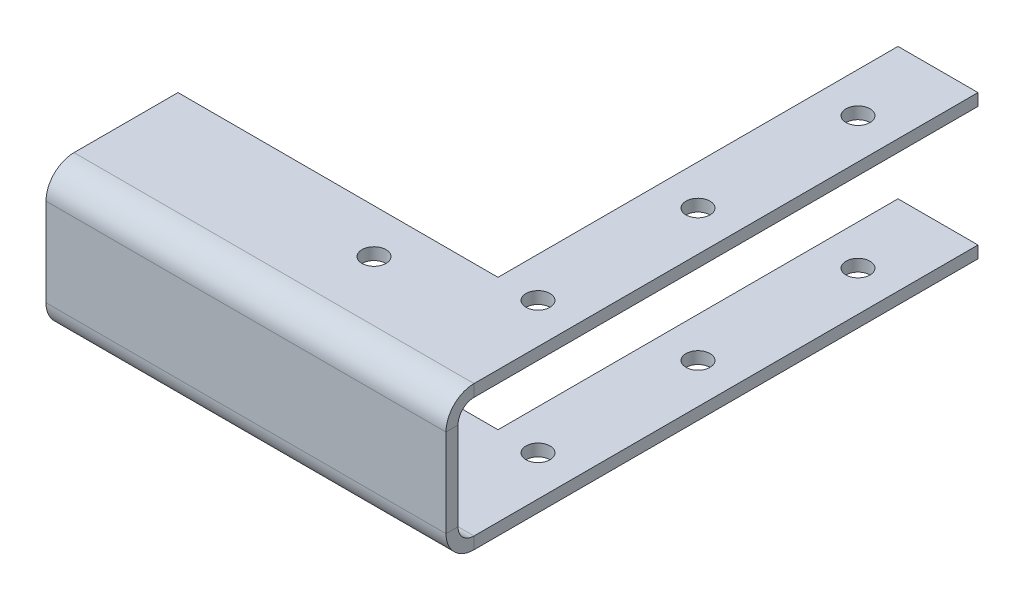
ISO-10303-21;
HEADER;
FILE_DESCRIPTION(('STEP AP214'),'2;1');
FILE_NAME('part.step','',(''),(''),'','','');
FILE_SCHEMA(('AUTOMOTIVE_DESIGN { 1 0 10303 214 1 1 1 1 }'));
ENDSEC;
DATA;
#1=APPLICATION_CONTEXT('core data for automotive mechanical design processes');
#2=APPLICATION_PROTOCOL_DEFINITION('international standard','automotive_design',2000,#1);
#3=PRODUCT_CONTEXT('',#1,'mechanical');
#4=PRODUCT('Part','Part','',(#3));
#5=PRODUCT_RELATED_PRODUCT_CATEGORY('part','',(#4));
#6=PRODUCT_DEFINITION_FORMATION('','',#4);
#7=PRODUCT_DEFINITION_CONTEXT('part definition',#1,'design');
#8=PRODUCT_DEFINITION('design','',#6,#7);
#9=PRODUCT_DEFINITION_SHAPE('','',#8);
#10=(LENGTH_UNIT() NAMED_UNIT(*) SI_UNIT(.MILLI.,.METRE.));
#11=(NAMED_UNIT(*) PLANE_ANGLE_UNIT() SI_UNIT($,.RADIAN.));
#12=(NAMED_UNIT(*) SI_UNIT($,.STERADIAN.) SOLID_ANGLE_UNIT());
#13=UNCERTAINTY_MEASURE_WITH_UNIT(LENGTH_MEASURE(1.E-05),#10,'distance_accuracy_value','');
#14=(GEOMETRIC_REPRESENTATION_CONTEXT(3) GLOBAL_UNCERTAINTY_ASSIGNED_CONTEXT((#13)) GLOBAL_UNIT_ASSIGNED_CONTEXT((#10,
#11,#12)) REPRESENTATION_CONTEXT('',''));
#15=CARTESIAN_POINT('',(0.,0.,0.));
#16=DIRECTION('',(0.,0.,1.));
#17=DIRECTION('',(1.,0.,0.));
#18=AXIS2_PLACEMENT_3D('',#15,#16,#17);
#19=CARTESIAN_POINT('',(-25.,9.00000000000004,-15.));
#20=DIRECTION('',(0.,0.,1.));
#21=DIRECTION('',(0.,-1.,0.));
#22=AXIS2_PLACEMENT_3D('',#19,#20,#21);
#23=PLANE('',#22);
#24=DIRECTION('',(0.,1.,0.));
#25=VECTOR('',#24,1.);
#26=CARTESIAN_POINT('',(15.,7.50000000000005,-15.));
#27=LINE('',#26,#25);
#28=CARTESIAN_POINT('',(15.,7.50000000000005,-15.));
#29=VERTEX_POINT('',#28);
#30=CARTESIAN_POINT('',(15.,9.00000000000005,-15.));
#31=VERTEX_POINT('',#30);
#32=EDGE_CURVE('E48',#29,#31,#27,.T.);
#33=ORIENTED_EDGE('',*,*,#32,.F.);
#34=DIRECTION('',(-1.,0.,0.));
#35=VECTOR('',#34,1.);
#36=CARTESIAN_POINT('',(-25.,7.50000000000004,-15.));
#37=LINE('',#36,#35);
#38=CARTESIAN_POINT('',(-25.,7.50000000000004,-15.));
#39=VERTEX_POINT('',#38);
#40=EDGE_CURVE('E158',#29,#39,#37,.T.);
#41=ORIENTED_EDGE('',*,*,#40,.T.);
#42=DIRECTION('',(0.,-1.,0.));
#43=VECTOR('',#42,1.);
#44=CARTESIAN_POINT('',(-25.,9.00000000000004,-15.));
#45=LINE('',#44,#43);
#46=CARTESIAN_POINT('',(-25.,9.00000000000004,-15.));
#47=VERTEX_POINT('',#46);
#48=EDGE_CURVE('E419',#47,#39,#45,.T.);
#49=ORIENTED_EDGE('',*,*,#48,.F.);
#50=DIRECTION('',(-1.,0.,0.));
#51=VECTOR('',#50,1.);
#52=CARTESIAN_POINT('',(-25.,9.00000000000004,-15.));
#53=LINE('',#52,#51);
#54=EDGE_CURVE('E190',#31,#47,#53,.T.);
#55=ORIENTED_EDGE('',*,*,#54,.F.);
#56=EDGE_LOOP('',(#33,#41,#49,#55));
#57=FACE_BOUND('',#56,.T.);
#58=ADVANCED_FACE('F33',(#57),#23,.F.);
#59=CARTESIAN_POINT('',(25.,-9.00000000000006,-15.));
#60=DIRECTION('',(0.,0.,1.));
#61=DIRECTION('',(0.,-1.,0.));
#62=AXIS2_PLACEMENT_3D('',#59,#60,#61);
#63=PLANE('',#62);
#64=DIRECTION('',(0.,1.,0.));
#65=VECTOR('',#64,1.);
#66=CARTESIAN_POINT('',(15.,-9.00000000000006,-15.));
#67=LINE('',#66,#65);
#68=CARTESIAN_POINT('',(15.,-9.00000000000006,-15.));
#69=VERTEX_POINT('',#68);
#70=CARTESIAN_POINT('',(15.,-7.50000000000006,-15.));
#71=VERTEX_POINT('',#70);
#72=EDGE_CURVE('E56',#69,#71,#67,.T.);
#73=ORIENTED_EDGE('',*,*,#72,.F.);
#74=DIRECTION('',(1.,0.,0.));
#75=VECTOR('',#74,1.);
#76=CARTESIAN_POINT('',(25.,-9.00000000000006,-15.));
#77=LINE('',#76,#75);
#78=CARTESIAN_POINT('',(-25.,-9.00000000000006,-15.));
#79=VERTEX_POINT('',#78);
#80=EDGE_CURVE('E361',#79,#69,#77,.T.);
#81=ORIENTED_EDGE('',*,*,#80,.F.);
#82=DIRECTION('',(0.,1.,0.));
#83=VECTOR('',#82,1.);
#84=CARTESIAN_POINT('',(-25.,-9.00000000000006,-15.));
#85=LINE('',#84,#83);
#86=CARTESIAN_POINT('',(-25.,-7.50000000000006,-15.));
#87=VERTEX_POINT('',#86);
#88=EDGE_CURVE('E360',#79,#87,#85,.T.);
#89=ORIENTED_EDGE('',*,*,#88,.T.);
#90=DIRECTION('',(1.,0.,0.));
#91=VECTOR('',#90,1.);
#92=CARTESIAN_POINT('',(25.,-7.50000000000006,-15.));
#93=LINE('',#92,#91);
#94=EDGE_CURVE('E374',#87,#71,#93,.T.);
#95=ORIENTED_EDGE('',*,*,#94,.T.);
#96=EDGE_LOOP('',(#73,#81,#89,#95));
#97=FACE_BOUND('',#96,.T.);
#98=ADVANCED_FACE('F241',(#97),#63,.F.);
#99=CARTESIAN_POINT('',(-25.,-7.50000000000001,1.5));
#100=DIRECTION('',(1.,0.,0.));
#101=DIRECTION('',(0.,0.,-1.));
#102=AXIS2_PLACEMENT_3D('',#99,#100,#101);
#103=PLANE('',#102);
#104=DIRECTION('',(0.,0.,1.));
#105=VECTOR('',#104,1.);
#106=CARTESIAN_POINT('',(-25.,-5.50000000000002,0.));
#107=LINE('',#106,#105);
#108=CARTESIAN_POINT('',(-25.,-5.50000000000002,0.));
#109=VERTEX_POINT('',#108);
#110=CARTESIAN_POINT('',(-25.,-5.50000000000002,1.5));
#111=VERTEX_POINT('',#110);
#112=EDGE_CURVE('E472',#109,#111,#107,.T.);
#113=ORIENTED_EDGE('',*,*,#112,.T.);
#114=DIRECTION('',(0.,-1.,0.));
#115=VECTOR('',#114,1.);
#116=CARTESIAN_POINT('',(-25.,-7.50000000000001,1.5));
#117=LINE('',#116,#115);
#118=CARTESIAN_POINT('',(-25.,5.5,1.5));
#119=VERTEX_POINT('',#118);
#120=EDGE_CURVE('E447',#119,#111,#117,.T.);
#121=ORIENTED_EDGE('',*,*,#120,.F.);
#122=DIRECTION('',(0.,0.,1.));
#123=VECTOR('',#122,1.);
#124=CARTESIAN_POINT('',(-25.,5.5,0.));
#125=LINE('',#124,#123);
#126=CARTESIAN_POINT('',(-25.,5.5,0.));
#127=VERTEX_POINT('',#126);
#128=EDGE_CURVE('E441',#127,#119,#125,.T.);
#129=ORIENTED_EDGE('',*,*,#128,.F.);
#130=DIRECTION('',(0.,-1.,0.));
#131=VECTOR('',#130,1.);
#132=CARTESIAN_POINT('',(-25.,-7.50000000000001,0.));
#133=LINE('',#132,#131);
#134=EDGE_CURVE('E444',#127,#109,#133,.T.);
#135=ORIENTED_EDGE('',*,*,#134,.T.);
#136=EDGE_LOOP('',(#113,#121,#129,#135));
#137=FACE_BOUND('',#136,.T.);
#138=ADVANCED_FACE('F246',(#137),#103,.F.);
#139=CARTESIAN_POINT('',(25.,-7.5,1.5));
#140=DIRECTION('',(-1.,0.,0.));
#141=DIRECTION('',(0.,0.,1.));
#142=AXIS2_PLACEMENT_3D('',#139,#140,#141);
#143=PLANE('',#142);
#144=DIRECTION('',(0.,0.,1.));
#145=VECTOR('',#144,1.);
#146=CARTESIAN_POINT('',(25.,-5.50000000000002,0.));
#147=LINE('',#146,#145);
#148=CARTESIAN_POINT('',(25.,-5.50000000000002,0.));
#149=VERTEX_POINT('',#148);
#150=CARTESIAN_POINT('',(25.,-5.50000000000002,1.5));
#151=VERTEX_POINT('',#150);
#152=EDGE_CURVE('E461',#149,#151,#147,.T.);
#153=ORIENTED_EDGE('',*,*,#152,.F.);
#154=DIRECTION('',(0.,1.,0.));
#155=VECTOR('',#154,1.);
#156=CARTESIAN_POINT('',(25.,-7.5,0.));
#157=LINE('',#156,#155);
#158=CARTESIAN_POINT('',(25.,5.5,0.));
#159=VERTEX_POINT('',#158);
#160=EDGE_CURVE('E379',#149,#159,#157,.T.);
#161=ORIENTED_EDGE('',*,*,#160,.T.);
#162=DIRECTION('',(0.,0.,1.));
#163=VECTOR('',#162,1.);
#164=CARTESIAN_POINT('',(25.,5.5,0.));
#165=LINE('',#164,#163);
#166=CARTESIAN_POINT('',(25.,5.50000000000001,1.49999999999999));
#167=VERTEX_POINT('',#166);
#168=EDGE_CURVE('E431',#159,#167,#165,.T.);
#169=ORIENTED_EDGE('',*,*,#168,.T.);
#170=DIRECTION('',(0.,1.,0.));
#171=VECTOR('',#170,1.);
#172=CARTESIAN_POINT('',(25.,-7.5,1.5));
#173=LINE('',#172,#171);
#174=EDGE_CURVE('E214',#151,#167,#173,.T.);
#175=ORIENTED_EDGE('',*,*,#174,.F.);
#176=EDGE_LOOP('',(#153,#161,#169,#175));
#177=FACE_BOUND('',#176,.T.);
#178=ADVANCED_FACE('F274',(#177),#143,.F.);
#179=CARTESIAN_POINT('',(-25.,7.49999999999999,1.5));
#180=DIRECTION('',(0.,0.,1.));
#181=DIRECTION('',(1.,0.,0.));
#182=AXIS2_PLACEMENT_3D('',#179,#180,#181);
#183=PLANE('',#182);
#184=ORIENTED_EDGE('',*,*,#120,.T.);
#185=DIRECTION('',(-1.,0.,0.));
#186=VECTOR('',#185,1.);
#187=CARTESIAN_POINT('',(-25.,-5.50000000000002,1.5));
#188=LINE('',#187,#186);
#189=EDGE_CURVE('E485',#111,#151,#188,.F.);
#190=ORIENTED_EDGE('',*,*,#189,.T.);
#191=ORIENTED_EDGE('',*,*,#174,.T.);
#192=DIRECTION('',(1.,0.,0.));
#193=VECTOR('',#192,1.);
#194=CARTESIAN_POINT('',(25.,5.50000000000001,1.49999999999999));
#195=LINE('',#194,#193);
#196=EDGE_CURVE('E424',#167,#119,#195,.F.);
#197=ORIENTED_EDGE('',*,*,#196,.T.);
#198=EDGE_LOOP('',(#184,#190,#191,#197));
#199=FACE_BOUND('',#198,.T.);
#200=ADVANCED_FACE('F271',(#199),#183,.T.);
#201=CARTESIAN_POINT('',(-25.,7.49999999999999,0.));
#202=DIRECTION('',(0.,0.,1.));
#203=DIRECTION('',(1.,0.,0.));
#204=AXIS2_PLACEMENT_3D('',#201,#202,#203);
#205=PLANE('',#204);
#206=DIRECTION('',(-1.,0.,0.));
#207=VECTOR('',#206,1.);
#208=CARTESIAN_POINT('',(-25.,-5.50000000000002,0.));
#209=LINE('',#208,#207);
#210=EDGE_CURVE('E495',#109,#149,#209,.F.);
#211=ORIENTED_EDGE('',*,*,#210,.F.);
#212=ORIENTED_EDGE('',*,*,#134,.F.);
#213=DIRECTION('',(1.,0.,0.));
#214=VECTOR('',#213,1.);
#215=CARTESIAN_POINT('',(25.,5.5,0.));
#216=LINE('',#215,#214);
#217=EDGE_CURVE('E437',#159,#127,#216,.F.);
#218=ORIENTED_EDGE('',*,*,#217,.F.);
#219=ORIENTED_EDGE('',*,*,#160,.F.);
#220=EDGE_LOOP('',(#211,#212,#218,#219));
#221=FACE_BOUND('',#220,.T.);
#222=ADVANCED_FACE('F266',(#221),#205,.F.);
#223=CARTESIAN_POINT('',(-25.,5.5,-2.));
#224=DIRECTION('',(-1.,0.,0.));
#225=DIRECTION('',(0.,0.,1.));
#226=AXIS2_PLACEMENT_3D('',#223,#224,#225);
#227=PLANE('',#226);
#228=DIRECTION('',(0.,1.,0.));
#229=VECTOR('',#228,1.);
#230=CARTESIAN_POINT('',(-25.,7.5,-1.99999999999999));
#231=LINE('',#230,#229);
#232=CARTESIAN_POINT('',(-25.,7.5,-1.99999999999999));
#233=VERTEX_POINT('',#232);
#234=CARTESIAN_POINT('',(-25.,9.,-1.99999999999999));
#235=VERTEX_POINT('',#234);
#236=EDGE_CURVE('E466',#233,#235,#231,.T.);
#237=ORIENTED_EDGE('',*,*,#236,.F.);
#238=CARTESIAN_POINT('',(-25.,5.5,-2.));
#239=DIRECTION('',(1.,0.,0.));
#240=DIRECTION('',(0.,0.,-1.));
#241=AXIS2_PLACEMENT_3D('',#238,#239,#240);
#242=CIRCLE('',#241,2.);
#243=EDGE_CURVE('E434',#127,#233,#242,.F.);
#244=ORIENTED_EDGE('',*,*,#243,.F.);
#245=ORIENTED_EDGE('',*,*,#128,.T.);
#246=CARTESIAN_POINT('',(-25.,5.5,-2.));
#247=DIRECTION('',(1.,0.,0.));
#248=DIRECTION('',(0.,0.,-1.));
#249=AXIS2_PLACEMENT_3D('',#246,#247,#248);
#250=CIRCLE('',#249,3.5);
#251=EDGE_CURVE('E427',#119,#235,#250,.F.);
#252=ORIENTED_EDGE('',*,*,#251,.T.);
#253=EDGE_LOOP('',(#237,#244,#245,#252));
#254=FACE_BOUND('',#253,.T.);
#255=ADVANCED_FACE('F260',(#254),#227,.T.);
#256=CARTESIAN_POINT('',(25.,5.5,-2.));
#257=DIRECTION('',(-1.,0.,0.));
#258=DIRECTION('',(0.,0.,1.));
#259=AXIS2_PLACEMENT_3D('',#256,#257,#258);
#260=PLANE('',#259);
#261=CARTESIAN_POINT('',(25.,5.5,-2.));
#262=DIRECTION('',(1.,0.,0.));
#263=DIRECTION('',(0.,0.,-1.));
#264=AXIS2_PLACEMENT_3D('',#261,#262,#263);
#265=CIRCLE('',#264,2.);
#266=CARTESIAN_POINT('',(25.,7.5,-1.99999999999999));
#267=VERTEX_POINT('',#266);
#268=EDGE_CURVE('E422',#267,#159,#265,.T.);
#269=ORIENTED_EDGE('',*,*,#268,.F.);
#270=DIRECTION('',(0.,1.,0.));
#271=VECTOR('',#270,1.);
#272=CARTESIAN_POINT('',(25.,7.5,-1.99999999999999));
#273=LINE('',#272,#271);
#274=CARTESIAN_POINT('',(25.,9.,-1.99999999999999));
#275=VERTEX_POINT('',#274);
#276=EDGE_CURVE('E155',#267,#275,#273,.T.);
#277=ORIENTED_EDGE('',*,*,#276,.T.);
#278=CARTESIAN_POINT('',(25.,5.5,-2.));
#279=DIRECTION('',(1.,0.,0.));
#280=DIRECTION('',(0.,0.,-1.));
#281=AXIS2_PLACEMENT_3D('',#278,#279,#280);
#282=CIRCLE('',#281,3.5);
#283=EDGE_CURVE('E428',#275,#167,#282,.T.);
#284=ORIENTED_EDGE('',*,*,#283,.T.);
#285=ORIENTED_EDGE('',*,*,#168,.F.);
#286=EDGE_LOOP('',(#269,#277,#284,#285));
#287=FACE_BOUND('',#286,.T.);
#288=ADVANCED_FACE('F258',(#287),#260,.F.);
#289=CARTESIAN_POINT('',(25.,5.5,-2.));
#290=DIRECTION('',(1.,0.,0.));
#291=DIRECTION('',(0.,1.,0.));
#292=AXIS2_PLACEMENT_3D('',#289,#290,#291);
#293=CYLINDRICAL_SURFACE('',#292,3.5);
#294=ORIENTED_EDGE('',*,*,#196,.F.);
#295=ORIENTED_EDGE('',*,*,#283,.F.);
#296=DIRECTION('',(-1.,0.,0.));
#297=VECTOR('',#296,1.);
#298=CARTESIAN_POINT('',(-25.,9.,-1.99999999999999));
#299=LINE('',#298,#297);
#300=EDGE_CURVE('E159',#275,#235,#299,.T.);
#301=ORIENTED_EDGE('',*,*,#300,.T.);
#302=ORIENTED_EDGE('',*,*,#251,.F.);
#303=EDGE_LOOP('',(#294,#295,#301,#302));
#304=FACE_BOUND('',#303,.T.);
#305=ADVANCED_FACE('F255',(#304),#293,.T.);
#306=CARTESIAN_POINT('',(25.,5.5,-2.));
#307=DIRECTION('',(1.,0.,0.));
#308=DIRECTION('',(0.,1.,0.));
#309=AXIS2_PLACEMENT_3D('',#306,#307,#308);
#310=CYLINDRICAL_SURFACE('',#309,2.);
#311=ORIENTED_EDGE('',*,*,#217,.T.);
#312=ORIENTED_EDGE('',*,*,#243,.T.);
#313=DIRECTION('',(1.,0.,0.));
#314=VECTOR('',#313,1.);
#315=CARTESIAN_POINT('',(-25.,7.5,-1.99999999999999));
#316=LINE('',#315,#314);
#317=EDGE_CURVE('E469',#233,#267,#316,.T.);
#318=ORIENTED_EDGE('',*,*,#317,.T.);
#319=ORIENTED_EDGE('',*,*,#268,.T.);
#320=EDGE_LOOP('',(#311,#312,#318,#319));
#321=FACE_BOUND('',#320,.T.);
#322=ADVANCED_FACE('F254',(#321),#310,.F.);
#323=CARTESIAN_POINT('',(25.,9.00000000000005,-15.));
#324=DIRECTION('',(-1.,0.,0.));
#325=DIRECTION('',(0.,0.,1.));
#326=AXIS2_PLACEMENT_3D('',#323,#324,#325);
#327=PLANE('',#326);
#328=ORIENTED_EDGE('',*,*,#276,.F.);
#329=DIRECTION('',(0.,0.,-1.));
#330=VECTOR('',#329,1.);
#331=CARTESIAN_POINT('',(25.,7.50000000000005,-15.));
#332=LINE('',#331,#330);
#333=CARTESIAN_POINT('',(25.,7.50000000000022,-65.));
#334=VERTEX_POINT('',#333);
#335=EDGE_CURVE('E148',#267,#334,#332,.T.);
#336=ORIENTED_EDGE('',*,*,#335,.T.);
#337=DIRECTION('',(0.,-1.,0.));
#338=VECTOR('',#337,1.);
#339=CARTESIAN_POINT('',(25.,7.50000000000022,-65.));
#340=LINE('',#339,#338);
#341=CARTESIAN_POINT('',(25.,9.00000000000022,-65.));
#342=VERTEX_POINT('',#341);
#343=EDGE_CURVE('E153',#342,#334,#340,.T.);
#344=ORIENTED_EDGE('',*,*,#343,.F.);
#345=DIRECTION('',(0.,0.,-1.));
#346=VECTOR('',#345,1.);
#347=CARTESIAN_POINT('',(25.,9.00000000000005,-15.));
#348=LINE('',#347,#346);
#349=EDGE_CURVE('E418',#275,#342,#348,.T.);
#350=ORIENTED_EDGE('',*,*,#349,.F.);
#351=EDGE_LOOP('',(#328,#336,#344,#350));
#352=FACE_BOUND('',#351,.T.);
#353=ADVANCED_FACE('F150',(#352),#327,.F.);
#354=CARTESIAN_POINT('',(-25.,8.99999999999999,0.));
#355=DIRECTION('',(1.,0.,0.));
#356=DIRECTION('',(0.,0.,-1.));
#357=AXIS2_PLACEMENT_3D('',#354,#355,#356);
#358=PLANE('',#357);
#359=ORIENTED_EDGE('',*,*,#236,.T.);
#360=DIRECTION('',(0.,0.,1.));
#361=VECTOR('',#360,1.);
#362=CARTESIAN_POINT('',(-25.,8.99999999999999,0.));
#363=LINE('',#362,#361);
#364=EDGE_CURVE('E423',#47,#235,#363,.T.);
#365=ORIENTED_EDGE('',*,*,#364,.F.);
#366=ORIENTED_EDGE('',*,*,#48,.T.);
#367=DIRECTION('',(0.,0.,1.));
#368=VECTOR('',#367,1.);
#369=CARTESIAN_POINT('',(-25.,7.49999999999999,0.));
#370=LINE('',#369,#368);
#371=EDGE_CURVE('E412',#39,#233,#370,.T.);
#372=ORIENTED_EDGE('',*,*,#371,.T.);
#373=EDGE_LOOP('',(#359,#365,#366,#372));
#374=FACE_BOUND('',#373,.T.);
#375=ADVANCED_FACE('F250',(#374),#358,.F.);
#376=CARTESIAN_POINT('',(-25.,8.99999999999999,0.));
#377=DIRECTION('',(0.,-1.,0.));
#378=DIRECTION('',(0.,0.,-1.));
#379=AXIS2_PLACEMENT_3D('',#376,#377,#378);
#380=PLANE('',#379);
#381=CARTESIAN_POINT('',(20.,9.00000000000026,-35.0000000000001));
#382=DIRECTION('',(0.,-1.,0.));
#383=DIRECTION('',(0.,0.,-1.));
#384=AXIS2_PLACEMENT_3D('',#381,#382,#383);
#385=CIRCLE('',#384,1.5);
#386=CARTESIAN_POINT('',(20.,9.00000000000026,-36.5000000000001));
#387=VERTEX_POINT('',#386);
#388=EDGE_CURVE('E532',#387,#387,#385,.T.);
#389=ORIENTED_EDGE('',*,*,#388,.T.);
#390=EDGE_LOOP('',(#389));
#391=FACE_BOUND('',#390,.T.);
#392=CARTESIAN_POINT('',(20.,9.00000000000019,-55.0000000000001));
#393=DIRECTION('',(0.,-1.,0.));
#394=DIRECTION('',(0.,0.,-1.));
#395=AXIS2_PLACEMENT_3D('',#392,#393,#394);
#396=CIRCLE('',#395,1.5);
#397=CARTESIAN_POINT('',(20.,9.0000000000002,-56.5000000000001));
#398=VERTEX_POINT('',#397);
#399=EDGE_CURVE('E540',#398,#398,#396,.T.);
#400=ORIENTED_EDGE('',*,*,#399,.T.);
#401=EDGE_LOOP('',(#400));
#402=FACE_BOUND('',#401,.T.);
#403=CARTESIAN_POINT('',(4.99999999999999,9.00000000000003,-9.50000000000005));
#404=DIRECTION('',(0.,-1.,0.));
#405=DIRECTION('',(0.,0.,-1.));
#406=AXIS2_PLACEMENT_3D('',#403,#404,#405);
#407=CIRCLE('',#406,1.5);
#408=CARTESIAN_POINT('',(4.99999999999999,9.00000000000003,-11.0000000000001));
#409=VERTEX_POINT('',#408);
#410=EDGE_CURVE('E176',#409,#409,#407,.T.);
#411=ORIENTED_EDGE('',*,*,#410,.T.);
#412=EDGE_LOOP('',(#411));
#413=FACE_BOUND('',#412,.T.);
#414=ORIENTED_EDGE('',*,*,#300,.F.);
#415=ORIENTED_EDGE('',*,*,#349,.T.);
#416=DIRECTION('',(1.,0.,0.));
#417=VECTOR('',#416,1.);
#418=CARTESIAN_POINT('',(25.,9.00000000000022,-65.));
#419=LINE('',#418,#417);
#420=CARTESIAN_POINT('',(15.,9.00000000000023,-65.));
#421=VERTEX_POINT('',#420);
#422=EDGE_CURVE('E174',#421,#342,#419,.T.);
#423=ORIENTED_EDGE('',*,*,#422,.F.);
#424=DIRECTION('',(0.,0.,1.));
#425=VECTOR('',#424,1.);
#426=CARTESIAN_POINT('',(15.,9.00000000000023,-65.));
#427=LINE('',#426,#425);
#428=EDGE_CURVE('E183',#421,#31,#427,.T.);
#429=ORIENTED_EDGE('',*,*,#428,.T.);
#430=ORIENTED_EDGE('',*,*,#54,.T.);
#431=ORIENTED_EDGE('',*,*,#364,.T.);
#432=EDGE_LOOP('',(#414,#415,#423,#429,#430,#431));
#433=FACE_BOUND('',#432,.T.);
#434=CARTESIAN_POINT('',(20.,9.00000000000033,-15.0000000000001));
#435=DIRECTION('',(0.,-1.,0.));
#436=DIRECTION('',(0.,0.,-1.));
#437=AXIS2_PLACEMENT_3D('',#434,#435,#436);
#438=CIRCLE('',#437,1.5);
#439=CARTESIAN_POINT('',(20.,9.00000000000033,-16.5000000000001));
#440=VERTEX_POINT('',#439);
#441=EDGE_CURVE('E213',#440,#440,#438,.T.);
#442=ORIENTED_EDGE('',*,*,#441,.T.);
#443=EDGE_LOOP('',(#442));
#444=FACE_BOUND('',#443,.T.);
#445=ADVANCED_FACE('F302',(#391,#402,#413,#433,#444),#380,.F.);
#446=CARTESIAN_POINT('',(-25.,7.49999999999999,0.));
#447=DIRECTION('',(0.,-1.,0.));
#448=DIRECTION('',(0.,0.,-1.));
#449=AXIS2_PLACEMENT_3D('',#446,#447,#448);
#450=PLANE('',#449);
#451=CARTESIAN_POINT('',(20.,7.50000000000026,-35.));
#452=DIRECTION('',(0.,-1.,0.));
#453=DIRECTION('',(0.,0.,-1.));
#454=AXIS2_PLACEMENT_3D('',#451,#452,#453);
#455=CIRCLE('',#454,1.5);
#456=CARTESIAN_POINT('',(20.,7.50000000000026,-36.5));
#457=VERTEX_POINT('',#456);
#458=EDGE_CURVE('E534',#457,#457,#455,.T.);
#459=ORIENTED_EDGE('',*,*,#458,.F.);
#460=EDGE_LOOP('',(#459));
#461=FACE_BOUND('',#460,.T.);
#462=CARTESIAN_POINT('',(20.,7.50000000000019,-55.));
#463=DIRECTION('',(0.,-1.,0.));
#464=DIRECTION('',(0.,0.,-1.));
#465=AXIS2_PLACEMENT_3D('',#462,#463,#464);
#466=CIRCLE('',#465,1.5);
#467=CARTESIAN_POINT('',(20.,7.50000000000019,-56.5));
#468=VERTEX_POINT('',#467);
#469=EDGE_CURVE('E208',#468,#468,#466,.T.);
#470=ORIENTED_EDGE('',*,*,#469,.F.);
#471=EDGE_LOOP('',(#470));
#472=FACE_BOUND('',#471,.T.);
#473=CARTESIAN_POINT('',(4.99999999999999,7.50000000000003,-9.50000000000005));
#474=DIRECTION('',(0.,-1.,0.));
#475=DIRECTION('',(0.,0.,-1.));
#476=AXIS2_PLACEMENT_3D('',#473,#474,#475);
#477=CIRCLE('',#476,1.5);
#478=CARTESIAN_POINT('',(4.99999999999999,7.50000000000003,-11.));
#479=VERTEX_POINT('',#478);
#480=EDGE_CURVE('E203',#479,#479,#477,.T.);
#481=ORIENTED_EDGE('',*,*,#480,.F.);
#482=EDGE_LOOP('',(#481));
#483=FACE_BOUND('',#482,.T.);
#484=ORIENTED_EDGE('',*,*,#335,.F.);
#485=ORIENTED_EDGE('',*,*,#317,.F.);
#486=ORIENTED_EDGE('',*,*,#371,.F.);
#487=ORIENTED_EDGE('',*,*,#40,.F.);
#488=DIRECTION('',(0.,0.,1.));
#489=VECTOR('',#488,1.);
#490=CARTESIAN_POINT('',(15.,7.50000000000022,-65.));
#491=LINE('',#490,#489);
#492=CARTESIAN_POINT('',(15.,7.50000000000022,-65.));
#493=VERTEX_POINT('',#492);
#494=EDGE_CURVE('E166',#493,#29,#491,.T.);
#495=ORIENTED_EDGE('',*,*,#494,.F.);
#496=DIRECTION('',(-1.,0.,0.));
#497=VECTOR('',#496,1.);
#498=CARTESIAN_POINT('',(25.,7.50000000000022,-65.));
#499=LINE('',#498,#497);
#500=EDGE_CURVE('E162',#334,#493,#499,.T.);
#501=ORIENTED_EDGE('',*,*,#500,.F.);
#502=EDGE_LOOP('',(#484,#485,#486,#487,#495,#501));
#503=FACE_BOUND('',#502,.T.);
#504=CARTESIAN_POINT('',(20.,7.50000000000033,-15.));
#505=DIRECTION('',(0.,-1.,0.));
#506=DIRECTION('',(0.,0.,-1.));
#507=AXIS2_PLACEMENT_3D('',#504,#505,#506);
#508=CIRCLE('',#507,1.5);
#509=CARTESIAN_POINT('',(20.,7.50000000000033,-16.5));
#510=VERTEX_POINT('',#509);
#511=EDGE_CURVE('E210',#510,#510,#508,.T.);
#512=ORIENTED_EDGE('',*,*,#511,.F.);
#513=EDGE_LOOP('',(#512));
#514=FACE_BOUND('',#513,.T.);
#515=ADVANCED_FACE('F163',(#461,#472,#483,#503,#514),#450,.T.);
#516=CARTESIAN_POINT('',(25.,-5.50000000000001,-2.));
#517=DIRECTION('',(1.,0.,0.));
#518=DIRECTION('',(0.,0.,-1.));
#519=AXIS2_PLACEMENT_3D('',#516,#517,#518);
#520=PLANE('',#519);
#521=DIRECTION('',(0.,-1.,0.));
#522=VECTOR('',#521,1.);
#523=CARTESIAN_POINT('',(25.,-7.50000000000001,-1.99999999999999));
#524=LINE('',#523,#522);
#525=CARTESIAN_POINT('',(25.,-7.50000000000001,-1.99999999999999));
#526=VERTEX_POINT('',#525);
#527=CARTESIAN_POINT('',(25.,-9.00000000000001,-1.99999999999999));
#528=VERTEX_POINT('',#527);
#529=EDGE_CURVE('E340',#526,#528,#524,.T.);
#530=ORIENTED_EDGE('',*,*,#529,.F.);
#531=CARTESIAN_POINT('',(25.,-5.50000000000001,-2.));
#532=DIRECTION('',(-1.,0.,0.));
#533=DIRECTION('',(0.,0.,1.));
#534=AXIS2_PLACEMENT_3D('',#531,#532,#533);
#535=CIRCLE('',#534,2.);
#536=EDGE_CURVE('E491',#149,#526,#535,.F.);
#537=ORIENTED_EDGE('',*,*,#536,.F.);
#538=ORIENTED_EDGE('',*,*,#152,.T.);
#539=CARTESIAN_POINT('',(25.,-5.50000000000001,-2.));
#540=DIRECTION('',(-1.,0.,0.));
#541=DIRECTION('',(0.,0.,1.));
#542=AXIS2_PLACEMENT_3D('',#539,#540,#541);
#543=CIRCLE('',#542,3.5);
#544=EDGE_CURVE('E487',#151,#528,#543,.F.);
#545=ORIENTED_EDGE('',*,*,#544,.T.);
#546=EDGE_LOOP('',(#530,#537,#538,#545));
#547=FACE_BOUND('',#546,.T.);
#548=ADVANCED_FACE('F310',(#547),#520,.T.);
#549=CARTESIAN_POINT('',(-25.,-5.50000000000001,-2.));
#550=DIRECTION('',(1.,0.,0.));
#551=DIRECTION('',(0.,0.,-1.));
#552=AXIS2_PLACEMENT_3D('',#549,#550,#551);
#553=PLANE('',#552);
#554=CARTESIAN_POINT('',(-25.,-5.50000000000001,-2.));
#555=DIRECTION('',(-1.,0.,0.));
#556=DIRECTION('',(0.,0.,1.));
#557=AXIS2_PLACEMENT_3D('',#554,#555,#556);
#558=CIRCLE('',#557,2.);
#559=CARTESIAN_POINT('',(-25.,-7.50000000000001,-1.99999999999999));
#560=VERTEX_POINT('',#559);
#561=EDGE_CURVE('E364',#560,#109,#558,.T.);
#562=ORIENTED_EDGE('',*,*,#561,.F.);
#563=DIRECTION('',(0.,-1.,0.));
#564=VECTOR('',#563,1.);
#565=CARTESIAN_POINT('',(-25.,-7.50000000000002,-1.99999999999999));
#566=LINE('',#565,#564);
#567=CARTESIAN_POINT('',(-25.,-9.00000000000001,-1.99999999999999));
#568=VERTEX_POINT('',#567);
#569=EDGE_CURVE('E392',#560,#568,#566,.T.);
#570=ORIENTED_EDGE('',*,*,#569,.T.);
#571=CARTESIAN_POINT('',(-25.,-5.50000000000001,-2.));
#572=DIRECTION('',(-1.,0.,0.));
#573=DIRECTION('',(0.,0.,1.));
#574=AXIS2_PLACEMENT_3D('',#571,#572,#573);
#575=CIRCLE('',#574,3.5);
#576=EDGE_CURVE('E488',#568,#111,#575,.T.);
#577=ORIENTED_EDGE('',*,*,#576,.T.);
#578=ORIENTED_EDGE('',*,*,#112,.F.);
#579=EDGE_LOOP('',(#562,#570,#577,#578));
#580=FACE_BOUND('',#579,.T.);
#581=ADVANCED_FACE('F316',(#580),#553,.F.);
#582=CARTESIAN_POINT('',(-25.,-5.50000000000001,-2.));
#583=DIRECTION('',(-1.,0.,0.));
#584=DIRECTION('',(0.,-1.,0.));
#585=AXIS2_PLACEMENT_3D('',#582,#583,#584);
#586=CYLINDRICAL_SURFACE('',#585,3.5);
#587=ORIENTED_EDGE('',*,*,#189,.F.);
#588=ORIENTED_EDGE('',*,*,#576,.F.);
#589=DIRECTION('',(1.,0.,0.));
#590=VECTOR('',#589,1.);
#591=CARTESIAN_POINT('',(-25.,-9.00000000000002,-1.99999999999999));
#592=LINE('',#591,#590);
#593=EDGE_CURVE('E355',#568,#528,#592,.T.);
#594=ORIENTED_EDGE('',*,*,#593,.T.);
#595=ORIENTED_EDGE('',*,*,#544,.F.);
#596=EDGE_LOOP('',(#587,#588,#594,#595));
#597=FACE_BOUND('',#596,.T.);
#598=ADVANCED_FACE('F319',(#597),#586,.T.);
#599=CARTESIAN_POINT('',(-25.,-5.50000000000001,-2.));
#600=DIRECTION('',(-1.,0.,0.));
#601=DIRECTION('',(0.,-1.,0.));
#602=AXIS2_PLACEMENT_3D('',#599,#600,#601);
#603=CYLINDRICAL_SURFACE('',#602,2.);
#604=ORIENTED_EDGE('',*,*,#210,.T.);
#605=ORIENTED_EDGE('',*,*,#536,.T.);
#606=DIRECTION('',(-1.,0.,0.));
#607=VECTOR('',#606,1.);
#608=CARTESIAN_POINT('',(25.,-7.50000000000001,-1.99999999999999));
#609=LINE('',#608,#607);
#610=EDGE_CURVE('E349',#526,#560,#609,.T.);
#611=ORIENTED_EDGE('',*,*,#610,.T.);
#612=ORIENTED_EDGE('',*,*,#561,.T.);
#613=EDGE_LOOP('',(#604,#605,#611,#612));
#614=FACE_BOUND('',#613,.T.);
#615=ADVANCED_FACE('F321',(#614),#603,.F.);
#616=CARTESIAN_POINT('',(-25.,-9.00000000000006,-15.));
#617=DIRECTION('',(1.,0.,0.));
#618=DIRECTION('',(0.,1.,0.));
#619=AXIS2_PLACEMENT_3D('',#616,#617,#618);
#620=PLANE('',#619);
#621=ORIENTED_EDGE('',*,*,#569,.F.);
#622=DIRECTION('',(0.,0.,-1.));
#623=VECTOR('',#622,1.);
#624=CARTESIAN_POINT('',(-25.,-7.50000000000006,-15.));
#625=LINE('',#624,#623);
#626=EDGE_CURVE('E372',#560,#87,#625,.T.);
#627=ORIENTED_EDGE('',*,*,#626,.T.);
#628=ORIENTED_EDGE('',*,*,#88,.F.);
#629=DIRECTION('',(0.,0.,-1.));
#630=VECTOR('',#629,1.);
#631=CARTESIAN_POINT('',(-25.,-9.00000000000006,-15.));
#632=LINE('',#631,#630);
#633=EDGE_CURVE('E366',#568,#79,#632,.T.);
#634=ORIENTED_EDGE('',*,*,#633,.F.);
#635=EDGE_LOOP('',(#621,#627,#628,#634));
#636=FACE_BOUND('',#635,.T.);
#637=ADVANCED_FACE('F327',(#636),#620,.F.);
#638=CARTESIAN_POINT('',(25.,-9.,0.));
#639=DIRECTION('',(-1.,0.,0.));
#640=DIRECTION('',(0.,-1.,0.));
#641=AXIS2_PLACEMENT_3D('',#638,#639,#640);
#642=PLANE('',#641);
#643=ORIENTED_EDGE('',*,*,#529,.T.);
#644=DIRECTION('',(0.,0.,1.));
#645=VECTOR('',#644,1.);
#646=CARTESIAN_POINT('',(25.,-9.,0.));
#647=LINE('',#646,#645);
#648=CARTESIAN_POINT('',(25.,-9.00000000000023,-65.));
#649=VERTEX_POINT('',#648);
#650=EDGE_CURVE('E343',#649,#528,#647,.T.);
#651=ORIENTED_EDGE('',*,*,#650,.F.);
#652=DIRECTION('',(0.,-1.,0.));
#653=VECTOR('',#652,1.);
#654=CARTESIAN_POINT('',(25.,-9.00000000000023,-65.));
#655=LINE('',#654,#653);
#656=CARTESIAN_POINT('',(25.,-7.50000000000023,-65.));
#657=VERTEX_POINT('',#656);
#658=EDGE_CURVE('E186',#657,#649,#655,.T.);
#659=ORIENTED_EDGE('',*,*,#658,.F.);
#660=DIRECTION('',(0.,0.,1.));
#661=VECTOR('',#660,1.);
#662=CARTESIAN_POINT('',(25.,-7.5,0.));
#663=LINE('',#662,#661);
#664=EDGE_CURVE('E345',#657,#526,#663,.T.);
#665=ORIENTED_EDGE('',*,*,#664,.T.);
#666=EDGE_LOOP('',(#643,#651,#659,#665));
#667=FACE_BOUND('',#666,.T.);
#668=ADVANCED_FACE('F234',(#667),#642,.F.);
#669=CARTESIAN_POINT('',(-25.,-9.00000000000001,0.));
#670=DIRECTION('',(0.,1.,0.));
#671=DIRECTION('',(0.,0.,1.));
#672=AXIS2_PLACEMENT_3D('',#669,#670,#671);
#673=PLANE('',#672);
#674=CARTESIAN_POINT('',(20.,-9.00000000000012,-35.));
#675=DIRECTION('',(0.,-1.,0.));
#676=DIRECTION('',(0.,0.,-1.));
#677=AXIS2_PLACEMENT_3D('',#674,#675,#676);
#678=CIRCLE('',#677,1.5);
#679=CARTESIAN_POINT('',(20.,-9.00000000000013,-36.5));
#680=VERTEX_POINT('',#679);
#681=EDGE_CURVE('E560',#680,#680,#678,.T.);
#682=ORIENTED_EDGE('',*,*,#681,.F.);
#683=EDGE_LOOP('',(#682));
#684=FACE_BOUND('',#683,.T.);
#685=CARTESIAN_POINT('',(20.,-9.00000000000019,-55.));
#686=DIRECTION('',(0.,-1.,0.));
#687=DIRECTION('',(0.,0.,-1.));
#688=AXIS2_PLACEMENT_3D('',#685,#686,#687);
#689=CIRCLE('',#688,1.5);
#690=CARTESIAN_POINT('',(20.,-9.0000000000002,-56.5));
#691=VERTEX_POINT('',#690);
#692=EDGE_CURVE('E209',#691,#691,#689,.T.);
#693=ORIENTED_EDGE('',*,*,#692,.F.);
#694=EDGE_LOOP('',(#693));
#695=FACE_BOUND('',#694,.T.);
#696=CARTESIAN_POINT('',(4.99999999999999,-9.00000000000004,-9.49999999999999));
#697=DIRECTION('',(0.,-1.,0.));
#698=DIRECTION('',(0.,0.,-1.));
#699=AXIS2_PLACEMENT_3D('',#696,#697,#698);
#700=CIRCLE('',#699,1.5);
#701=CARTESIAN_POINT('',(4.99999999999999,-9.00000000000004,-11.));
#702=VERTEX_POINT('',#701);
#703=EDGE_CURVE('E204',#702,#702,#700,.T.);
#704=ORIENTED_EDGE('',*,*,#703,.F.);
#705=EDGE_LOOP('',(#704));
#706=FACE_BOUND('',#705,.T.);
#707=ORIENTED_EDGE('',*,*,#593,.F.);
#708=ORIENTED_EDGE('',*,*,#633,.T.);
#709=ORIENTED_EDGE('',*,*,#80,.T.);
#710=DIRECTION('',(0.,0.,1.));
#711=VECTOR('',#710,1.);
#712=CARTESIAN_POINT('',(15.,-9.00000000000023,-65.));
#713=LINE('',#712,#711);
#714=CARTESIAN_POINT('',(15.,-9.00000000000023,-65.));
#715=VERTEX_POINT('',#714);
#716=EDGE_CURVE('E350',#715,#69,#713,.T.);
#717=ORIENTED_EDGE('',*,*,#716,.F.);
#718=DIRECTION('',(-1.,0.,0.));
#719=VECTOR('',#718,1.);
#720=CARTESIAN_POINT('',(25.,-9.00000000000023,-65.));
#721=LINE('',#720,#719);
#722=EDGE_CURVE('E358',#649,#715,#721,.T.);
#723=ORIENTED_EDGE('',*,*,#722,.F.);
#724=ORIENTED_EDGE('',*,*,#650,.T.);
#725=EDGE_LOOP('',(#707,#708,#709,#717,#723,#724));
#726=FACE_BOUND('',#725,.T.);
#727=CARTESIAN_POINT('',(20.,-9.00000000000006,-15.));
#728=DIRECTION('',(0.,-1.,0.));
#729=DIRECTION('',(0.,0.,-1.));
#730=AXIS2_PLACEMENT_3D('',#727,#728,#729);
#731=CIRCLE('',#730,1.5);
#732=CARTESIAN_POINT('',(20.,-9.00000000000006,-16.5));
#733=VERTEX_POINT('',#732);
#734=EDGE_CURVE('E11',#733,#733,#731,.T.);
#735=ORIENTED_EDGE('',*,*,#734,.F.);
#736=EDGE_LOOP('',(#735));
#737=FACE_BOUND('',#736,.T.);
#738=ADVANCED_FACE('F224',(#684,#695,#706,#726,#737),#673,.F.);
#739=CARTESIAN_POINT('',(-25.,-7.50000000000001,0.));
#740=DIRECTION('',(0.,1.,0.));
#741=DIRECTION('',(0.,0.,1.));
#742=AXIS2_PLACEMENT_3D('',#739,#740,#741);
#743=PLANE('',#742);
#744=CARTESIAN_POINT('',(20.,-7.50000000000012,-35.));
#745=DIRECTION('',(0.,1.,0.));
#746=DIRECTION('',(0.,0.,1.));
#747=AXIS2_PLACEMENT_3D('',#744,#745,#746);
#748=CIRCLE('',#747,1.5);
#749=CARTESIAN_POINT('',(20.,-7.50000000000012,-33.5));
#750=VERTEX_POINT('',#749);
#751=EDGE_CURVE('E563',#750,#750,#748,.T.);
#752=ORIENTED_EDGE('',*,*,#751,.F.);
#753=EDGE_LOOP('',(#752));
#754=FACE_BOUND('',#753,.T.);
#755=CARTESIAN_POINT('',(20.,-7.50000000000019,-55.));
#756=DIRECTION('',(0.,1.,0.));
#757=DIRECTION('',(0.,0.,1.));
#758=AXIS2_PLACEMENT_3D('',#755,#756,#757);
#759=CIRCLE('',#758,1.5);
#760=CARTESIAN_POINT('',(20.,-7.50000000000019,-53.5));
#761=VERTEX_POINT('',#760);
#762=EDGE_CURVE('E205',#761,#761,#759,.T.);
#763=ORIENTED_EDGE('',*,*,#762,.F.);
#764=EDGE_LOOP('',(#763));
#765=FACE_BOUND('',#764,.T.);
#766=CARTESIAN_POINT('',(4.99999999999999,-7.50000000000003,-9.5));
#767=DIRECTION('',(0.,1.,0.));
#768=DIRECTION('',(0.,0.,1.));
#769=AXIS2_PLACEMENT_3D('',#766,#767,#768);
#770=CIRCLE('',#769,1.5);
#771=CARTESIAN_POINT('',(4.99999999999999,-7.50000000000003,-8.));
#772=VERTEX_POINT('',#771);
#773=EDGE_CURVE('E200',#772,#772,#770,.T.);
#774=ORIENTED_EDGE('',*,*,#773,.F.);
#775=EDGE_LOOP('',(#774));
#776=FACE_BOUND('',#775,.T.);
#777=ORIENTED_EDGE('',*,*,#626,.F.);
#778=ORIENTED_EDGE('',*,*,#610,.F.);
#779=ORIENTED_EDGE('',*,*,#664,.F.);
#780=DIRECTION('',(1.,0.,0.));
#781=VECTOR('',#780,1.);
#782=CARTESIAN_POINT('',(25.,-7.50000000000023,-65.));
#783=LINE('',#782,#781);
#784=CARTESIAN_POINT('',(15.,-7.50000000000024,-65.));
#785=VERTEX_POINT('',#784);
#786=EDGE_CURVE('E389',#785,#657,#783,.T.);
#787=ORIENTED_EDGE('',*,*,#786,.F.);
#788=DIRECTION('',(0.,0.,1.));
#789=VECTOR('',#788,1.);
#790=CARTESIAN_POINT('',(15.,-7.50000000000024,-65.));
#791=LINE('',#790,#789);
#792=EDGE_CURVE('E384',#785,#71,#791,.T.);
#793=ORIENTED_EDGE('',*,*,#792,.T.);
#794=ORIENTED_EDGE('',*,*,#94,.F.);
#795=EDGE_LOOP('',(#777,#778,#779,#787,#793,#794));
#796=FACE_BOUND('',#795,.T.);
#797=CARTESIAN_POINT('',(20.,-7.50000000000005,-15.));
#798=DIRECTION('',(0.,1.,0.));
#799=DIRECTION('',(0.,0.,1.));
#800=AXIS2_PLACEMENT_3D('',#797,#798,#799);
#801=CIRCLE('',#800,1.5);
#802=CARTESIAN_POINT('',(20.,-7.50000000000005,-13.5));
#803=VERTEX_POINT('',#802);
#804=EDGE_CURVE('E41',#803,#803,#801,.T.);
#805=ORIENTED_EDGE('',*,*,#804,.F.);
#806=EDGE_LOOP('',(#805));
#807=FACE_BOUND('',#806,.T.);
#808=ADVANCED_FACE('F221',(#754,#765,#776,#796,#807),#743,.T.);
#809=CARTESIAN_POINT('',(15.,-9.00000000000023,-65.));
#810=DIRECTION('',(1.,0.,0.));
#811=DIRECTION('',(0.,1.,0.));
#812=AXIS2_PLACEMENT_3D('',#809,#810,#811);
#813=PLANE('',#812);
#814=ORIENTED_EDGE('',*,*,#72,.T.);
#815=ORIENTED_EDGE('',*,*,#792,.F.);
#816=DIRECTION('',(0.,1.,0.));
#817=VECTOR('',#816,1.);
#818=CARTESIAN_POINT('',(15.,-9.00000000000023,-65.));
#819=LINE('',#818,#817);
#820=EDGE_CURVE('E406',#715,#785,#819,.T.);
#821=ORIENTED_EDGE('',*,*,#820,.F.);
#822=ORIENTED_EDGE('',*,*,#716,.T.);
#823=EDGE_LOOP('',(#814,#815,#821,#822));
#824=FACE_BOUND('',#823,.T.);
#825=ADVANCED_FACE('F223',(#824),#813,.F.);
#826=CARTESIAN_POINT('',(25.,-7.50000000000023,-65.));
#827=DIRECTION('',(0.,0.,1.));
#828=DIRECTION('',(0.,-1.,0.));
#829=AXIS2_PLACEMENT_3D('',#826,#827,#828);
#830=PLANE('',#829);
#831=ORIENTED_EDGE('',*,*,#658,.T.);
#832=ORIENTED_EDGE('',*,*,#722,.T.);
#833=ORIENTED_EDGE('',*,*,#820,.T.);
#834=ORIENTED_EDGE('',*,*,#786,.T.);
#835=EDGE_LOOP('',(#831,#832,#833,#834));
#836=FACE_BOUND('',#835,.T.);
#837=ADVANCED_FACE('F231',(#836),#830,.F.);
#838=CARTESIAN_POINT('',(15.,7.50000000000022,-65.));
#839=DIRECTION('',(1.,0.,0.));
#840=DIRECTION('',(0.,0.,-1.));
#841=AXIS2_PLACEMENT_3D('',#838,#839,#840);
#842=PLANE('',#841);
#843=ORIENTED_EDGE('',*,*,#32,.T.);
#844=ORIENTED_EDGE('',*,*,#428,.F.);
#845=DIRECTION('',(0.,1.,0.));
#846=VECTOR('',#845,1.);
#847=CARTESIAN_POINT('',(15.,7.50000000000022,-65.));
#848=LINE('',#847,#846);
#849=EDGE_CURVE('E169',#493,#421,#848,.T.);
#850=ORIENTED_EDGE('',*,*,#849,.F.);
#851=ORIENTED_EDGE('',*,*,#494,.T.);
#852=EDGE_LOOP('',(#843,#844,#850,#851));
#853=FACE_BOUND('',#852,.T.);
#854=ADVANCED_FACE('F503',(#853),#842,.F.);
#855=CARTESIAN_POINT('',(25.,9.00000000000022,-65.));
#856=DIRECTION('',(0.,0.,1.));
#857=DIRECTION('',(0.,-1.,0.));
#858=AXIS2_PLACEMENT_3D('',#855,#856,#857);
#859=PLANE('',#858);
#860=ORIENTED_EDGE('',*,*,#343,.T.);
#861=ORIENTED_EDGE('',*,*,#500,.T.);
#862=ORIENTED_EDGE('',*,*,#849,.T.);
#863=ORIENTED_EDGE('',*,*,#422,.T.);
#864=EDGE_LOOP('',(#860,#861,#862,#863));
#865=FACE_BOUND('',#864,.T.);
#866=ADVANCED_FACE('F172',(#865),#859,.F.);
#867=CARTESIAN_POINT('',(4.99999999999999,41.,-9.50000000000017));
#868=DIRECTION('',(0.,-1.,0.));
#869=DIRECTION('',(0.,0.,-1.));
#870=AXIS2_PLACEMENT_3D('',#867,#868,#869);
#871=CYLINDRICAL_SURFACE('',#870,1.5);
#872=ORIENTED_EDGE('',*,*,#773,.T.);
#873=EDGE_LOOP('',(#872));
#874=FACE_BOUND('',#873,.T.);
#875=ORIENTED_EDGE('',*,*,#703,.T.);
#876=EDGE_LOOP('',(#875));
#877=FACE_BOUND('',#876,.T.);
#878=ADVANCED_FACE('F513',(#874,#877),#871,.F.);
#879=ORIENTED_EDGE('',*,*,#480,.T.);
#880=EDGE_LOOP('',(#879));
#881=FACE_BOUND('',#880,.T.);
#882=ORIENTED_EDGE('',*,*,#410,.F.);
#883=EDGE_LOOP('',(#882));
#884=FACE_BOUND('',#883,.T.);
#885=ADVANCED_FACE('F516',(#881,#884),#871,.F.);
#886=CARTESIAN_POINT('',(20.,9.00005000000009,-55.0000000000001));
#887=DIRECTION('',(0.,-1.,0.));
#888=DIRECTION('',(0.,0.,-1.));
#889=AXIS2_PLACEMENT_3D('',#886,#887,#888);
#890=CYLINDRICAL_SURFACE('',#889,1.5);
#891=ORIENTED_EDGE('',*,*,#762,.T.);
#892=EDGE_LOOP('',(#891));
#893=FACE_BOUND('',#892,.T.);
#894=ORIENTED_EDGE('',*,*,#692,.T.);
#895=EDGE_LOOP('',(#894));
#896=FACE_BOUND('',#895,.T.);
#897=ADVANCED_FACE('F518',(#893,#896),#890,.F.);
#898=ORIENTED_EDGE('',*,*,#469,.T.);
#899=EDGE_LOOP('',(#898));
#900=FACE_BOUND('',#899,.T.);
#901=ORIENTED_EDGE('',*,*,#399,.F.);
#902=EDGE_LOOP('',(#901));
#903=FACE_BOUND('',#902,.T.);
#904=ADVANCED_FACE('F295',(#900,#903),#890,.F.);
#905=CARTESIAN_POINT('',(20.,9.00005000000016,-35.0000000000001));
#906=DIRECTION('',(0.,-1.,0.));
#907=DIRECTION('',(0.,0.,-1.));
#908=AXIS2_PLACEMENT_3D('',#905,#906,#907);
#909=CYLINDRICAL_SURFACE('',#908,1.5);
#910=ORIENTED_EDGE('',*,*,#458,.T.);
#911=EDGE_LOOP('',(#910));
#912=FACE_BOUND('',#911,.T.);
#913=ORIENTED_EDGE('',*,*,#388,.F.);
#914=EDGE_LOOP('',(#913));
#915=FACE_BOUND('',#914,.T.);
#916=ADVANCED_FACE('F287',(#912,#915),#909,.F.);
#917=CARTESIAN_POINT('',(20.,9.00005000000023,-15.0000000000001));
#918=DIRECTION('',(0.,-1.,0.));
#919=DIRECTION('',(0.,0.,-1.));
#920=AXIS2_PLACEMENT_3D('',#917,#918,#919);
#921=CYLINDRICAL_SURFACE('',#920,1.5);
#922=ORIENTED_EDGE('',*,*,#511,.T.);
#923=EDGE_LOOP('',(#922));
#924=FACE_BOUND('',#923,.T.);
#925=ORIENTED_EDGE('',*,*,#441,.F.);
#926=EDGE_LOOP('',(#925));
#927=FACE_BOUND('',#926,.T.);
#928=ADVANCED_FACE('F284',(#924,#927),#921,.F.);
#929=CARTESIAN_POINT('',(20.,9.00005000000016,-35.0000000000001));
#930=DIRECTION('',(0.,-1.,0.));
#931=DIRECTION('',(0.,0.,-1.));
#932=AXIS2_PLACEMENT_3D('',#929,#930,#931);
#933=CYLINDRICAL_SURFACE('',#932,1.5);
#934=ORIENTED_EDGE('',*,*,#751,.T.);
#935=EDGE_LOOP('',(#934));
#936=FACE_BOUND('',#935,.T.);
#937=ORIENTED_EDGE('',*,*,#681,.T.);
#938=EDGE_LOOP('',(#937));
#939=FACE_BOUND('',#938,.T.);
#940=ADVANCED_FACE('F286',(#936,#939),#933,.F.);
#941=CARTESIAN_POINT('',(20.,9.00005000000023,-15.0000000000001));
#942=DIRECTION('',(0.,-1.,0.));
#943=DIRECTION('',(0.,0.,-1.));
#944=AXIS2_PLACEMENT_3D('',#941,#942,#943);
#945=CYLINDRICAL_SURFACE('',#944,1.5);
#946=ORIENTED_EDGE('',*,*,#804,.T.);
#947=EDGE_LOOP('',(#946));
#948=FACE_BOUND('',#947,.T.);
#949=ORIENTED_EDGE('',*,*,#734,.T.);
#950=EDGE_LOOP('',(#949));
#951=FACE_BOUND('',#950,.T.);
#952=ADVANCED_FACE('F35',(#948,#951),#945,.F.);
#953=CLOSED_SHELL('',(#58,#98,#138,#178,#200,#222,#255,#288,#305,#322,#353,#375,#445,#515,#548,
#581,#598,#615,#637,#668,#738,#808,#825,#837,#854,#866,#878,#885,#897,#904,#916,#928,#940,#952));
#954=MANIFOLD_SOLID_BREP('B2',#953);
#955=ADVANCED_BREP_SHAPE_REPRESENTATION('',(#18,#954),#14);
#956=SHAPE_DEFINITION_REPRESENTATION(#9,#955);
ENDSEC;
END-ISO-10303-21;
